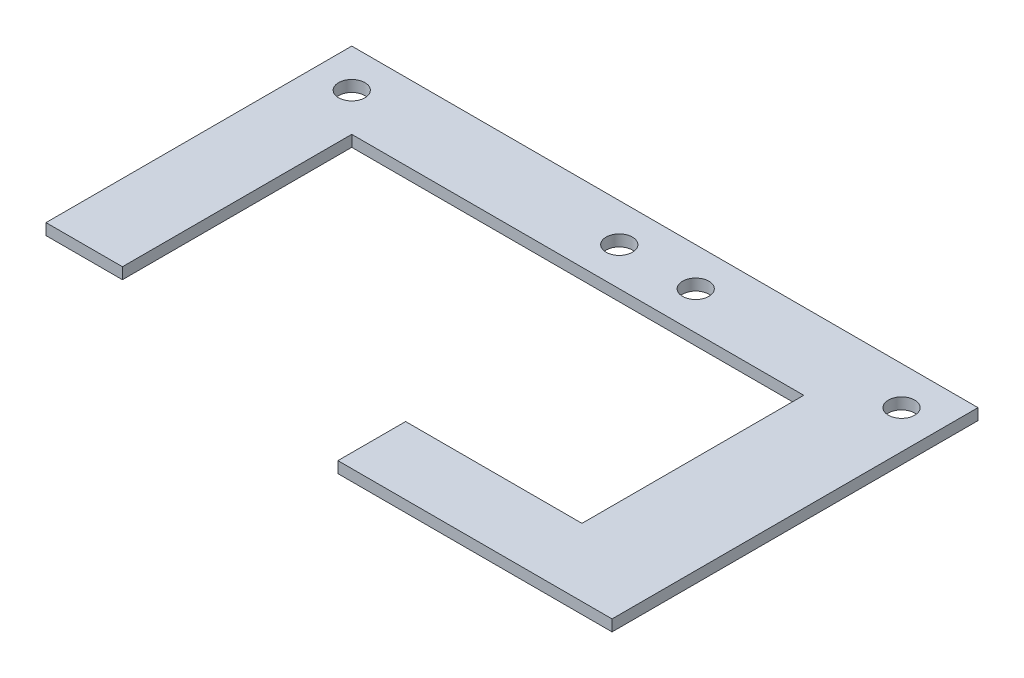
ISO-10303-21;
HEADER;
FILE_DESCRIPTION(('STEP AP214'),'2;1');
FILE_NAME('part.step','',(''),(''),'','','');
FILE_SCHEMA(('AUTOMOTIVE_DESIGN { 1 0 10303 214 1 1 1 1 }'));
ENDSEC;
DATA;
#1=APPLICATION_CONTEXT('core data for automotive mechanical design processes');
#2=APPLICATION_PROTOCOL_DEFINITION('international standard','automotive_design',2000,#1);
#3=PRODUCT_CONTEXT('',#1,'mechanical');
#4=PRODUCT('Part','Part','',(#3));
#5=PRODUCT_RELATED_PRODUCT_CATEGORY('part','',(#4));
#6=PRODUCT_DEFINITION_FORMATION('','',#4);
#7=PRODUCT_DEFINITION_CONTEXT('part definition',#1,'design');
#8=PRODUCT_DEFINITION('design','',#6,#7);
#9=PRODUCT_DEFINITION_SHAPE('','',#8);
#10=(LENGTH_UNIT() NAMED_UNIT(*) SI_UNIT(.MILLI.,.METRE.));
#11=(NAMED_UNIT(*) PLANE_ANGLE_UNIT() SI_UNIT($,.RADIAN.));
#12=(NAMED_UNIT(*) SI_UNIT($,.STERADIAN.) SOLID_ANGLE_UNIT());
#13=UNCERTAINTY_MEASURE_WITH_UNIT(LENGTH_MEASURE(1.E-05),#10,'distance_accuracy_value','');
#14=(GEOMETRIC_REPRESENTATION_CONTEXT(3) GLOBAL_UNCERTAINTY_ASSIGNED_CONTEXT((#13)) GLOBAL_UNIT_ASSIGNED_CONTEXT((#10,
#11,#12)) REPRESENTATION_CONTEXT('',''));
#15=CARTESIAN_POINT('',(0.,0.,0.));
#16=DIRECTION('',(0.,0.,1.));
#17=DIRECTION('',(1.,0.,0.));
#18=AXIS2_PLACEMENT_3D('',#15,#16,#17);
#19=CARTESIAN_POINT('',(0.,1.5,0.));
#20=DIRECTION('',(0.,1.,0.));
#21=DIRECTION('',(0.,0.,1.));
#22=AXIS2_PLACEMENT_3D('',#19,#20,#21);
#23=PLANE('',#22);
#24=CARTESIAN_POINT('',(-27.36,1.5,0.));
#25=DIRECTION('',(0.,1.,0.));
#26=DIRECTION('',(0.,0.,1.));
#27=AXIS2_PLACEMENT_3D('',#24,#25,#26);
#28=CIRCLE('',#27,1.75);
#29=CARTESIAN_POINT('',(-27.36,1.5,1.75));
#30=VERTEX_POINT('',#29);
#31=EDGE_CURVE('E257',#30,#30,#28,.T.);
#32=ORIENTED_EDGE('',*,*,#31,.F.);
#33=EDGE_LOOP('',(#32));
#34=FACE_BOUND('',#33,.T.);
#35=CARTESIAN_POINT('',(0.,1.5,0.));
#36=DIRECTION('',(0.,1.,0.));
#37=DIRECTION('',(0.,0.,1.));
#38=AXIS2_PLACEMENT_3D('',#35,#36,#37);
#39=CIRCLE('',#38,1.75);
#40=CARTESIAN_POINT('',(0.,1.5,1.75));
#41=VERTEX_POINT('',#40);
#42=EDGE_CURVE('E158',#41,#41,#39,.T.);
#43=ORIENTED_EDGE('',*,*,#42,.F.);
#44=EDGE_LOOP('',(#43));
#45=FACE_BOUND('',#44,.T.);
#46=DIRECTION('',(0.,0.,-1.));
#47=VECTOR('',#46,1.);
#48=CARTESIAN_POINT('',(5.08,1.5,43.56));
#49=LINE('',#48,#47);
#50=CARTESIAN_POINT('',(5.08,1.5,43.56));
#51=VERTEX_POINT('',#50);
#52=CARTESIAN_POINT('',(5.08,1.5,-5.08));
#53=VERTEX_POINT('',#52);
#54=EDGE_CURVE('E182',#51,#53,#49,.T.);
#55=ORIENTED_EDGE('',*,*,#54,.T.);
#56=DIRECTION('',(-1.,0.,0.));
#57=VECTOR('',#56,1.);
#58=CARTESIAN_POINT('',(5.08,1.5,-5.08));
#59=LINE('',#58,#57);
#60=CARTESIAN_POINT('',(-78.16,1.5,-5.07999999999999));
#61=VERTEX_POINT('',#60);
#62=EDGE_CURVE('E106',#53,#61,#59,.T.);
#63=ORIENTED_EDGE('',*,*,#62,.T.);
#64=DIRECTION('',(0.,0.,1.));
#65=VECTOR('',#64,1.);
#66=CARTESIAN_POINT('',(-78.16,1.5,-5.07999999999999));
#67=LINE('',#66,#65);
#68=CARTESIAN_POINT('',(-78.16,1.5,35.56));
#69=VERTEX_POINT('',#68);
#70=EDGE_CURVE('E211',#61,#69,#67,.T.);
#71=ORIENTED_EDGE('',*,*,#70,.T.);
#72=DIRECTION('',(1.,0.,0.));
#73=VECTOR('',#72,1.);
#74=CARTESIAN_POINT('',(-68.,1.5,35.56));
#75=LINE('',#74,#73);
#76=CARTESIAN_POINT('',(-68.,1.5,35.56));
#77=VERTEX_POINT('',#76);
#78=EDGE_CURVE('E231',#69,#77,#75,.T.);
#79=ORIENTED_EDGE('',*,*,#78,.T.);
#80=DIRECTION('',(0.,0.,-1.));
#81=VECTOR('',#80,1.);
#82=CARTESIAN_POINT('',(-68.,1.5,5.08));
#83=LINE('',#82,#81);
#84=CARTESIAN_POINT('',(-68.,1.5,5.08));
#85=VERTEX_POINT('',#84);
#86=EDGE_CURVE('E227',#77,#85,#83,.T.);
#87=ORIENTED_EDGE('',*,*,#86,.T.);
#88=DIRECTION('',(1.,0.,0.));
#89=VECTOR('',#88,1.);
#90=CARTESIAN_POINT('',(-7.92,1.5,5.08));
#91=LINE('',#90,#89);
#92=CARTESIAN_POINT('',(-7.92,1.5,5.08));
#93=VERTEX_POINT('',#92);
#94=EDGE_CURVE('E230',#85,#93,#91,.T.);
#95=ORIENTED_EDGE('',*,*,#94,.T.);
#96=DIRECTION('',(0.,0.,1.));
#97=VECTOR('',#96,1.);
#98=CARTESIAN_POINT('',(-7.92,1.5,34.56));
#99=LINE('',#98,#97);
#100=CARTESIAN_POINT('',(-7.92,1.5,34.56));
#101=VERTEX_POINT('',#100);
#102=EDGE_CURVE('E131',#93,#101,#99,.T.);
#103=ORIENTED_EDGE('',*,*,#102,.T.);
#104=DIRECTION('',(-1.,0.,0.));
#105=VECTOR('',#104,1.);
#106=CARTESIAN_POINT('',(-7.92,1.5,34.56));
#107=LINE('',#106,#105);
#108=CARTESIAN_POINT('',(-31.36,1.5,34.56));
#109=VERTEX_POINT('',#108);
#110=EDGE_CURVE('E125',#101,#109,#107,.T.);
#111=ORIENTED_EDGE('',*,*,#110,.T.);
#112=DIRECTION('',(0.,0.,1.));
#113=VECTOR('',#112,1.);
#114=CARTESIAN_POINT('',(-31.36,1.5,34.56));
#115=LINE('',#114,#113);
#116=CARTESIAN_POINT('',(-31.36,1.5,43.56));
#117=VERTEX_POINT('',#116);
#118=EDGE_CURVE('E129',#109,#117,#115,.T.);
#119=ORIENTED_EDGE('',*,*,#118,.T.);
#120=DIRECTION('',(1.,0.,0.));
#121=VECTOR('',#120,1.);
#122=CARTESIAN_POINT('',(5.08,1.5,43.56));
#123=LINE('',#122,#121);
#124=EDGE_CURVE('E57',#117,#51,#123,.T.);
#125=ORIENTED_EDGE('',*,*,#124,.T.);
#126=EDGE_LOOP('',(#55,#63,#71,#79,#87,#95,#103,#111,#119,#125));
#127=FACE_BOUND('',#126,.T.);
#128=CARTESIAN_POINT('',(-73.08,1.5,0.));
#129=DIRECTION('',(0.,1.,0.));
#130=DIRECTION('',(0.,0.,1.));
#131=AXIS2_PLACEMENT_3D('',#128,#129,#130);
#132=CIRCLE('',#131,1.75);
#133=CARTESIAN_POINT('',(-73.08,1.5,1.75));
#134=VERTEX_POINT('',#133);
#135=EDGE_CURVE('E249',#134,#134,#132,.T.);
#136=ORIENTED_EDGE('',*,*,#135,.F.);
#137=EDGE_LOOP('',(#136));
#138=FACE_BOUND('',#137,.T.);
#139=CARTESIAN_POINT('',(-37.52,1.5,0.));
#140=DIRECTION('',(0.,1.,0.));
#141=DIRECTION('',(0.,0.,1.));
#142=AXIS2_PLACEMENT_3D('',#139,#140,#141);
#143=CIRCLE('',#142,1.75);
#144=CARTESIAN_POINT('',(-37.52,1.5,1.75));
#145=VERTEX_POINT('',#144);
#146=EDGE_CURVE('E265',#145,#145,#143,.T.);
#147=ORIENTED_EDGE('',*,*,#146,.F.);
#148=EDGE_LOOP('',(#147));
#149=FACE_BOUND('',#148,.T.);
#150=ADVANCED_FACE('F39',(#34,#45,#127,#138,#149),#23,.T.);
#151=CARTESIAN_POINT('',(0.,0.,0.));
#152=DIRECTION('',(0.,1.,0.));
#153=DIRECTION('',(0.,0.,1.));
#154=AXIS2_PLACEMENT_3D('',#151,#152,#153);
#155=PLANE('',#154);
#156=DIRECTION('',(0.,0.,-1.));
#157=VECTOR('',#156,1.);
#158=CARTESIAN_POINT('',(5.08,0.,43.56));
#159=LINE('',#158,#157);
#160=CARTESIAN_POINT('',(5.08,0.,43.56));
#161=VERTEX_POINT('',#160);
#162=CARTESIAN_POINT('',(5.08,0.,-5.08));
#163=VERTEX_POINT('',#162);
#164=EDGE_CURVE('E153',#161,#163,#159,.T.);
#165=ORIENTED_EDGE('',*,*,#164,.F.);
#166=DIRECTION('',(1.,0.,0.));
#167=VECTOR('',#166,1.);
#168=CARTESIAN_POINT('',(5.08,0.,43.56));
#169=LINE('',#168,#167);
#170=CARTESIAN_POINT('',(-31.36,0.,43.56));
#171=VERTEX_POINT('',#170);
#172=EDGE_CURVE('E98',#171,#161,#169,.T.);
#173=ORIENTED_EDGE('',*,*,#172,.F.);
#174=DIRECTION('',(0.,0.,1.));
#175=VECTOR('',#174,1.);
#176=CARTESIAN_POINT('',(-31.36,0.,34.56));
#177=LINE('',#176,#175);
#178=CARTESIAN_POINT('',(-31.36,0.,34.56));
#179=VERTEX_POINT('',#178);
#180=EDGE_CURVE('E92',#179,#171,#177,.T.);
#181=ORIENTED_EDGE('',*,*,#180,.F.);
#182=DIRECTION('',(-1.,0.,0.));
#183=VECTOR('',#182,1.);
#184=CARTESIAN_POINT('',(-7.92,0.,34.56));
#185=LINE('',#184,#183);
#186=CARTESIAN_POINT('',(-7.92,0.,34.56));
#187=VERTEX_POINT('',#186);
#188=EDGE_CURVE('E140',#187,#179,#185,.T.);
#189=ORIENTED_EDGE('',*,*,#188,.F.);
#190=DIRECTION('',(0.,0.,1.));
#191=VECTOR('',#190,1.);
#192=CARTESIAN_POINT('',(-7.92,0.,34.56));
#193=LINE('',#192,#191);
#194=CARTESIAN_POINT('',(-7.92,0.,5.08));
#195=VERTEX_POINT('',#194);
#196=EDGE_CURVE('E173',#195,#187,#193,.T.);
#197=ORIENTED_EDGE('',*,*,#196,.F.);
#198=DIRECTION('',(1.,0.,0.));
#199=VECTOR('',#198,1.);
#200=CARTESIAN_POINT('',(-7.92,0.,5.08));
#201=LINE('',#200,#199);
#202=CARTESIAN_POINT('',(-68.,0.,5.08));
#203=VERTEX_POINT('',#202);
#204=EDGE_CURVE('E170',#203,#195,#201,.T.);
#205=ORIENTED_EDGE('',*,*,#204,.F.);
#206=DIRECTION('',(0.,0.,-1.));
#207=VECTOR('',#206,1.);
#208=CARTESIAN_POINT('',(-68.,0.,5.08));
#209=LINE('',#208,#207);
#210=CARTESIAN_POINT('',(-68.,0.,35.56));
#211=VERTEX_POINT('',#210);
#212=EDGE_CURVE('E167',#211,#203,#209,.T.);
#213=ORIENTED_EDGE('',*,*,#212,.F.);
#214=DIRECTION('',(1.,0.,0.));
#215=VECTOR('',#214,1.);
#216=CARTESIAN_POINT('',(-68.,0.,35.56));
#217=LINE('',#216,#215);
#218=CARTESIAN_POINT('',(-78.16,0.,35.56));
#219=VERTEX_POINT('',#218);
#220=EDGE_CURVE('E164',#219,#211,#217,.T.);
#221=ORIENTED_EDGE('',*,*,#220,.F.);
#222=DIRECTION('',(0.,0.,1.));
#223=VECTOR('',#222,1.);
#224=CARTESIAN_POINT('',(-78.16,0.,-5.07999999999999));
#225=LINE('',#224,#223);
#226=CARTESIAN_POINT('',(-78.16,0.,-5.07999999999999));
#227=VERTEX_POINT('',#226);
#228=EDGE_CURVE('E161',#227,#219,#225,.T.);
#229=ORIENTED_EDGE('',*,*,#228,.F.);
#230=DIRECTION('',(-1.,0.,0.));
#231=VECTOR('',#230,1.);
#232=CARTESIAN_POINT('',(5.08,0.,-5.08));
#233=LINE('',#232,#231);
#234=EDGE_CURVE('E157',#163,#227,#233,.T.);
#235=ORIENTED_EDGE('',*,*,#234,.F.);
#236=EDGE_LOOP('',(#165,#173,#181,#189,#197,#205,#213,#221,#229,#235));
#237=FACE_BOUND('',#236,.T.);
#238=CARTESIAN_POINT('',(0.,0.,0.));
#239=DIRECTION('',(0.,1.,0.));
#240=DIRECTION('',(0.,0.,1.));
#241=AXIS2_PLACEMENT_3D('',#238,#239,#240);
#242=CIRCLE('',#241,1.75);
#243=CARTESIAN_POINT('',(0.,0.,1.75));
#244=VERTEX_POINT('',#243);
#245=EDGE_CURVE('E245',#244,#244,#242,.T.);
#246=ORIENTED_EDGE('',*,*,#245,.T.);
#247=EDGE_LOOP('',(#246));
#248=FACE_BOUND('',#247,.T.);
#249=CARTESIAN_POINT('',(-73.08,0.,0.));
#250=DIRECTION('',(0.,1.,0.));
#251=DIRECTION('',(0.,0.,1.));
#252=AXIS2_PLACEMENT_3D('',#249,#250,#251);
#253=CIRCLE('',#252,1.75);
#254=CARTESIAN_POINT('',(-73.08,0.,1.75));
#255=VERTEX_POINT('',#254);
#256=EDGE_CURVE('E253',#255,#255,#253,.T.);
#257=ORIENTED_EDGE('',*,*,#256,.T.);
#258=EDGE_LOOP('',(#257));
#259=FACE_BOUND('',#258,.T.);
#260=CARTESIAN_POINT('',(-27.36,0.,0.));
#261=DIRECTION('',(0.,1.,0.));
#262=DIRECTION('',(0.,0.,1.));
#263=AXIS2_PLACEMENT_3D('',#260,#261,#262);
#264=CIRCLE('',#263,1.75);
#265=CARTESIAN_POINT('',(-27.36,0.,1.75));
#266=VERTEX_POINT('',#265);
#267=EDGE_CURVE('E261',#266,#266,#264,.T.);
#268=ORIENTED_EDGE('',*,*,#267,.T.);
#269=EDGE_LOOP('',(#268));
#270=FACE_BOUND('',#269,.T.);
#271=CARTESIAN_POINT('',(-37.52,0.,0.));
#272=DIRECTION('',(0.,1.,0.));
#273=DIRECTION('',(0.,0.,1.));
#274=AXIS2_PLACEMENT_3D('',#271,#272,#273);
#275=CIRCLE('',#274,1.75);
#276=CARTESIAN_POINT('',(-37.52,0.,1.75));
#277=VERTEX_POINT('',#276);
#278=EDGE_CURVE('E269',#277,#277,#275,.T.);
#279=ORIENTED_EDGE('',*,*,#278,.T.);
#280=EDGE_LOOP('',(#279));
#281=FACE_BOUND('',#280,.T.);
#282=ADVANCED_FACE('F215',(#237,#248,#259,#270,#281),#155,.F.);
#283=CARTESIAN_POINT('',(5.08,1.5,43.56));
#284=DIRECTION('',(-1.,0.,0.));
#285=DIRECTION('',(0.,0.,1.));
#286=AXIS2_PLACEMENT_3D('',#283,#284,#285);
#287=PLANE('',#286);
#288=ORIENTED_EDGE('',*,*,#164,.T.);
#289=DIRECTION('',(0.,-1.,0.));
#290=VECTOR('',#289,1.);
#291=CARTESIAN_POINT('',(5.08,1.5,-5.08));
#292=LINE('',#291,#290);
#293=EDGE_CURVE('E11',#53,#163,#292,.T.);
#294=ORIENTED_EDGE('',*,*,#293,.F.);
#295=ORIENTED_EDGE('',*,*,#54,.F.);
#296=DIRECTION('',(0.,-1.,0.));
#297=VECTOR('',#296,1.);
#298=CARTESIAN_POINT('',(5.08,1.5,43.56));
#299=LINE('',#298,#297);
#300=EDGE_CURVE('E149',#51,#161,#299,.T.);
#301=ORIENTED_EDGE('',*,*,#300,.T.);
#302=EDGE_LOOP('',(#288,#294,#295,#301));
#303=FACE_BOUND('',#302,.T.);
#304=ADVANCED_FACE('F41',(#303),#287,.F.);
#305=CARTESIAN_POINT('',(5.08,1.5,-5.08));
#306=DIRECTION('',(0.,0.,1.));
#307=DIRECTION('',(1.,0.,0.));
#308=AXIS2_PLACEMENT_3D('',#305,#306,#307);
#309=PLANE('',#308);
#310=ORIENTED_EDGE('',*,*,#234,.T.);
#311=DIRECTION('',(0.,-1.,0.));
#312=VECTOR('',#311,1.);
#313=CARTESIAN_POINT('',(-78.16,1.5,-5.07999999999999));
#314=LINE('',#313,#312);
#315=EDGE_CURVE('E49',#61,#227,#314,.T.);
#316=ORIENTED_EDGE('',*,*,#315,.F.);
#317=ORIENTED_EDGE('',*,*,#62,.F.);
#318=ORIENTED_EDGE('',*,*,#293,.T.);
#319=EDGE_LOOP('',(#310,#316,#317,#318));
#320=FACE_BOUND('',#319,.T.);
#321=ADVANCED_FACE('F313',(#320),#309,.F.);
#322=CARTESIAN_POINT('',(-78.16,1.5,-5.07999999999999));
#323=DIRECTION('',(1.,0.,0.));
#324=DIRECTION('',(0.,0.,-1.));
#325=AXIS2_PLACEMENT_3D('',#322,#323,#324);
#326=PLANE('',#325);
#327=ORIENTED_EDGE('',*,*,#228,.T.);
#328=DIRECTION('',(0.,-1.,0.));
#329=VECTOR('',#328,1.);
#330=CARTESIAN_POINT('',(-78.16,1.5,35.56));
#331=LINE('',#330,#329);
#332=EDGE_CURVE('E201',#69,#219,#331,.T.);
#333=ORIENTED_EDGE('',*,*,#332,.F.);
#334=ORIENTED_EDGE('',*,*,#70,.F.);
#335=ORIENTED_EDGE('',*,*,#315,.T.);
#336=EDGE_LOOP('',(#327,#333,#334,#335));
#337=FACE_BOUND('',#336,.T.);
#338=ADVANCED_FACE('F209',(#337),#326,.F.);
#339=CARTESIAN_POINT('',(-68.,1.5,35.56));
#340=DIRECTION('',(0.,0.,-1.));
#341=DIRECTION('',(-1.,0.,0.));
#342=AXIS2_PLACEMENT_3D('',#339,#340,#341);
#343=PLANE('',#342);
#344=ORIENTED_EDGE('',*,*,#220,.T.);
#345=DIRECTION('',(0.,-1.,0.));
#346=VECTOR('',#345,1.);
#347=CARTESIAN_POINT('',(-68.,1.5,35.56));
#348=LINE('',#347,#346);
#349=EDGE_CURVE('E197',#77,#211,#348,.T.);
#350=ORIENTED_EDGE('',*,*,#349,.F.);
#351=ORIENTED_EDGE('',*,*,#78,.F.);
#352=ORIENTED_EDGE('',*,*,#332,.T.);
#353=EDGE_LOOP('',(#344,#350,#351,#352));
#354=FACE_BOUND('',#353,.T.);
#355=ADVANCED_FACE('F221',(#354),#343,.F.);
#356=CARTESIAN_POINT('',(-68.,1.5,5.08));
#357=DIRECTION('',(-1.,0.,0.));
#358=DIRECTION('',(0.,0.,1.));
#359=AXIS2_PLACEMENT_3D('',#356,#357,#358);
#360=PLANE('',#359);
#361=ORIENTED_EDGE('',*,*,#212,.T.);
#362=DIRECTION('',(0.,-1.,0.));
#363=VECTOR('',#362,1.);
#364=CARTESIAN_POINT('',(-68.,1.5,5.08));
#365=LINE('',#364,#363);
#366=EDGE_CURVE('E193',#85,#203,#365,.T.);
#367=ORIENTED_EDGE('',*,*,#366,.F.);
#368=ORIENTED_EDGE('',*,*,#86,.F.);
#369=ORIENTED_EDGE('',*,*,#349,.T.);
#370=EDGE_LOOP('',(#361,#367,#368,#369));
#371=FACE_BOUND('',#370,.T.);
#372=ADVANCED_FACE('F225',(#371),#360,.F.);
#373=CARTESIAN_POINT('',(-7.92,1.5,5.08));
#374=DIRECTION('',(0.,0.,-1.));
#375=DIRECTION('',(-1.,0.,0.));
#376=AXIS2_PLACEMENT_3D('',#373,#374,#375);
#377=PLANE('',#376);
#378=ORIENTED_EDGE('',*,*,#204,.T.);
#379=DIRECTION('',(0.,-1.,0.));
#380=VECTOR('',#379,1.);
#381=CARTESIAN_POINT('',(-7.92,1.5,5.08));
#382=LINE('',#381,#380);
#383=EDGE_CURVE('E189',#93,#195,#382,.T.);
#384=ORIENTED_EDGE('',*,*,#383,.F.);
#385=ORIENTED_EDGE('',*,*,#94,.F.);
#386=ORIENTED_EDGE('',*,*,#366,.T.);
#387=EDGE_LOOP('',(#378,#384,#385,#386));
#388=FACE_BOUND('',#387,.T.);
#389=ADVANCED_FACE('F303',(#388),#377,.F.);
#390=CARTESIAN_POINT('',(-7.92,1.5,34.56));
#391=DIRECTION('',(1.,0.,0.));
#392=DIRECTION('',(0.,0.,-1.));
#393=AXIS2_PLACEMENT_3D('',#390,#391,#392);
#394=PLANE('',#393);
#395=ORIENTED_EDGE('',*,*,#196,.T.);
#396=DIRECTION('',(0.,-1.,0.));
#397=VECTOR('',#396,1.);
#398=CARTESIAN_POINT('',(-7.92,1.5,34.56));
#399=LINE('',#398,#397);
#400=EDGE_CURVE('E142',#101,#187,#399,.T.);
#401=ORIENTED_EDGE('',*,*,#400,.F.);
#402=ORIENTED_EDGE('',*,*,#102,.F.);
#403=ORIENTED_EDGE('',*,*,#383,.T.);
#404=EDGE_LOOP('',(#395,#401,#402,#403));
#405=FACE_BOUND('',#404,.T.);
#406=ADVANCED_FACE('F300',(#405),#394,.F.);
#407=CARTESIAN_POINT('',(-7.92,1.5,34.56));
#408=DIRECTION('',(0.,0.,1.));
#409=DIRECTION('',(1.,0.,0.));
#410=AXIS2_PLACEMENT_3D('',#407,#408,#409);
#411=PLANE('',#410);
#412=ORIENTED_EDGE('',*,*,#188,.T.);
#413=DIRECTION('',(0.,-1.,0.));
#414=VECTOR('',#413,1.);
#415=CARTESIAN_POINT('',(-31.36,1.5,34.56));
#416=LINE('',#415,#414);
#417=EDGE_CURVE('E137',#109,#179,#416,.T.);
#418=ORIENTED_EDGE('',*,*,#417,.F.);
#419=ORIENTED_EDGE('',*,*,#110,.F.);
#420=ORIENTED_EDGE('',*,*,#400,.T.);
#421=EDGE_LOOP('',(#412,#418,#419,#420));
#422=FACE_BOUND('',#421,.T.);
#423=ADVANCED_FACE('F138',(#422),#411,.F.);
#424=CARTESIAN_POINT('',(-31.36,1.5,34.56));
#425=DIRECTION('',(1.,0.,0.));
#426=DIRECTION('',(0.,0.,-1.));
#427=AXIS2_PLACEMENT_3D('',#424,#425,#426);
#428=PLANE('',#427);
#429=ORIENTED_EDGE('',*,*,#180,.T.);
#430=DIRECTION('',(0.,-1.,0.));
#431=VECTOR('',#430,1.);
#432=CARTESIAN_POINT('',(-31.36,1.5,43.56));
#433=LINE('',#432,#431);
#434=EDGE_CURVE('E143',#117,#171,#433,.T.);
#435=ORIENTED_EDGE('',*,*,#434,.F.);
#436=ORIENTED_EDGE('',*,*,#118,.F.);
#437=ORIENTED_EDGE('',*,*,#417,.T.);
#438=EDGE_LOOP('',(#429,#435,#436,#437));
#439=FACE_BOUND('',#438,.T.);
#440=ADVANCED_FACE('F145',(#439),#428,.F.);
#441=CARTESIAN_POINT('',(5.08,1.5,43.56));
#442=DIRECTION('',(0.,0.,-1.));
#443=DIRECTION('',(-1.,0.,0.));
#444=AXIS2_PLACEMENT_3D('',#441,#442,#443);
#445=PLANE('',#444);
#446=ORIENTED_EDGE('',*,*,#172,.T.);
#447=ORIENTED_EDGE('',*,*,#300,.F.);
#448=ORIENTED_EDGE('',*,*,#124,.F.);
#449=ORIENTED_EDGE('',*,*,#434,.T.);
#450=EDGE_LOOP('',(#446,#447,#448,#449));
#451=FACE_BOUND('',#450,.T.);
#452=ADVANCED_FACE('F293',(#451),#445,.F.);
#453=CARTESIAN_POINT('',(0.,1.5,0.));
#454=DIRECTION('',(0.,-1.,0.));
#455=DIRECTION('',(0.,0.,-1.));
#456=AXIS2_PLACEMENT_3D('',#453,#454,#455);
#457=CYLINDRICAL_SURFACE('',#456,1.75);
#458=ORIENTED_EDGE('',*,*,#42,.T.);
#459=EDGE_LOOP('',(#458));
#460=FACE_BOUND('',#459,.T.);
#461=ORIENTED_EDGE('',*,*,#245,.F.);
#462=EDGE_LOOP('',(#461));
#463=FACE_BOUND('',#462,.T.);
#464=ADVANCED_FACE('F290',(#460,#463),#457,.F.);
#465=CARTESIAN_POINT('',(-73.08,1.5,0.));
#466=DIRECTION('',(0.,-1.,0.));
#467=DIRECTION('',(0.,0.,-1.));
#468=AXIS2_PLACEMENT_3D('',#465,#466,#467);
#469=CYLINDRICAL_SURFACE('',#468,1.75);
#470=ORIENTED_EDGE('',*,*,#135,.T.);
#471=EDGE_LOOP('',(#470));
#472=FACE_BOUND('',#471,.T.);
#473=ORIENTED_EDGE('',*,*,#256,.F.);
#474=EDGE_LOOP('',(#473));
#475=FACE_BOUND('',#474,.T.);
#476=ADVANCED_FACE('F389',(#472,#475),#469,.F.);
#477=CARTESIAN_POINT('',(-27.36,1.5,0.));
#478=DIRECTION('',(0.,-1.,0.));
#479=DIRECTION('',(0.,0.,-1.));
#480=AXIS2_PLACEMENT_3D('',#477,#478,#479);
#481=CYLINDRICAL_SURFACE('',#480,1.75);
#482=ORIENTED_EDGE('',*,*,#31,.T.);
#483=EDGE_LOOP('',(#482));
#484=FACE_BOUND('',#483,.T.);
#485=ORIENTED_EDGE('',*,*,#267,.F.);
#486=EDGE_LOOP('',(#485));
#487=FACE_BOUND('',#486,.T.);
#488=ADVANCED_FACE('F397',(#484,#487),#481,.F.);
#489=CARTESIAN_POINT('',(-37.52,1.5,0.));
#490=DIRECTION('',(0.,-1.,0.));
#491=DIRECTION('',(0.,0.,-1.));
#492=AXIS2_PLACEMENT_3D('',#489,#490,#491);
#493=CYLINDRICAL_SURFACE('',#492,1.75);
#494=ORIENTED_EDGE('',*,*,#146,.T.);
#495=EDGE_LOOP('',(#494));
#496=FACE_BOUND('',#495,.T.);
#497=ORIENTED_EDGE('',*,*,#278,.F.);
#498=EDGE_LOOP('',(#497));
#499=FACE_BOUND('',#498,.T.);
#500=ADVANCED_FACE('F277',(#496,#499),#493,.F.);
#501=CLOSED_SHELL('',(#150,#282,#304,#321,#338,#355,#372,#389,#406,#423,#440,#452,#464,#476,
#488,#500));
#502=MANIFOLD_SOLID_BREP('B2',#501);
#503=ADVANCED_BREP_SHAPE_REPRESENTATION('',(#18,#502),#14);
#504=SHAPE_DEFINITION_REPRESENTATION(#9,#503);
ENDSEC;
END-ISO-10303-21;
